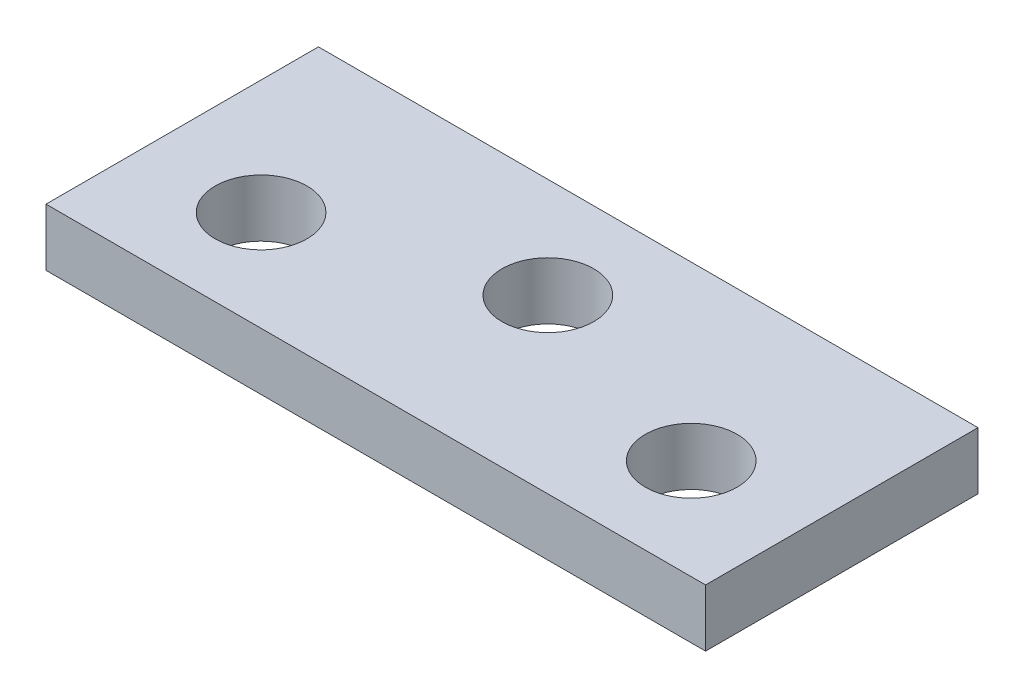
ISO-10303-21;
HEADER;
FILE_DESCRIPTION(('STEP AP214'),'2;1');
FILE_NAME('part.step','',(''),(''),'','','');
FILE_SCHEMA(('AUTOMOTIVE_DESIGN { 1 0 10303 214 1 1 1 1 }'));
ENDSEC;
DATA;
#1=APPLICATION_CONTEXT('core data for automotive mechanical design processes');
#2=APPLICATION_PROTOCOL_DEFINITION('international standard','automotive_design',2000,#1);
#3=PRODUCT_CONTEXT('',#1,'mechanical');
#4=PRODUCT('Part','Part','',(#3));
#5=PRODUCT_RELATED_PRODUCT_CATEGORY('part','',(#4));
#6=PRODUCT_DEFINITION_FORMATION('','',#4);
#7=PRODUCT_DEFINITION_CONTEXT('part definition',#1,'design');
#8=PRODUCT_DEFINITION('design','',#6,#7);
#9=PRODUCT_DEFINITION_SHAPE('','',#8);
#10=(LENGTH_UNIT() NAMED_UNIT(*) SI_UNIT(.MILLI.,.METRE.));
#11=(NAMED_UNIT(*) PLANE_ANGLE_UNIT() SI_UNIT($,.RADIAN.));
#12=(NAMED_UNIT(*) SI_UNIT($,.STERADIAN.) SOLID_ANGLE_UNIT());
#13=UNCERTAINTY_MEASURE_WITH_UNIT(LENGTH_MEASURE(1.E-05),#10,'distance_accuracy_value','');
#14=(GEOMETRIC_REPRESENTATION_CONTEXT(3) GLOBAL_UNCERTAINTY_ASSIGNED_CONTEXT((#13)) GLOBAL_UNIT_ASSIGNED_CONTEXT((#10,
#11,#12)) REPRESENTATION_CONTEXT('',''));
#15=CARTESIAN_POINT('',(0.,0.,0.));
#16=DIRECTION('',(0.,0.,1.));
#17=DIRECTION('',(1.,0.,0.));
#18=AXIS2_PLACEMENT_3D('',#15,#16,#17);
#19=CARTESIAN_POINT('',(-11.5,2.,4.75));
#20=DIRECTION('',(1.,0.,0.));
#21=DIRECTION('',(0.,0.,-1.));
#22=AXIS2_PLACEMENT_3D('',#19,#20,#21);
#23=PLANE('',#22);
#24=DIRECTION('',(0.,0.,1.));
#25=VECTOR('',#24,1.);
#26=CARTESIAN_POINT('',(-11.5,0.,4.75));
#27=LINE('',#26,#25);
#28=CARTESIAN_POINT('',(-11.5,0.,-4.75));
#29=VERTEX_POINT('',#28);
#30=CARTESIAN_POINT('',(-11.5,0.,4.75));
#31=VERTEX_POINT('',#30);
#32=EDGE_CURVE('E102',#29,#31,#27,.T.);
#33=ORIENTED_EDGE('',*,*,#32,.T.);
#34=DIRECTION('',(0.,-1.,0.));
#35=VECTOR('',#34,1.);
#36=CARTESIAN_POINT('',(-11.5,2.,4.75));
#37=LINE('',#36,#35);
#38=CARTESIAN_POINT('',(-11.5,2.,4.75));
#39=VERTEX_POINT('',#38);
#40=EDGE_CURVE('E11',#39,#31,#37,.T.);
#41=ORIENTED_EDGE('',*,*,#40,.F.);
#42=DIRECTION('',(0.,0.,1.));
#43=VECTOR('',#42,1.);
#44=CARTESIAN_POINT('',(-11.5,2.,4.75));
#45=LINE('',#44,#43);
#46=CARTESIAN_POINT('',(-11.5,2.,-4.75));
#47=VERTEX_POINT('',#46);
#48=EDGE_CURVE('E90',#47,#39,#45,.T.);
#49=ORIENTED_EDGE('',*,*,#48,.F.);
#50=DIRECTION('',(0.,-1.,0.));
#51=VECTOR('',#50,1.);
#52=CARTESIAN_POINT('',(-11.5,2.,-4.75));
#53=LINE('',#52,#51);
#54=EDGE_CURVE('E98',#47,#29,#53,.T.);
#55=ORIENTED_EDGE('',*,*,#54,.T.);
#56=EDGE_LOOP('',(#33,#41,#49,#55));
#57=FACE_BOUND('',#56,.T.);
#58=ADVANCED_FACE('F39',(#57),#23,.F.);
#59=CARTESIAN_POINT('',(11.5,2.,4.75));
#60=DIRECTION('',(0.,0.,-1.));
#61=DIRECTION('',(-1.,0.,0.));
#62=AXIS2_PLACEMENT_3D('',#59,#60,#61);
#63=PLANE('',#62);
#64=DIRECTION('',(1.,0.,0.));
#65=VECTOR('',#64,1.);
#66=CARTESIAN_POINT('',(11.5,0.,4.75));
#67=LINE('',#66,#65);
#68=CARTESIAN_POINT('',(11.5,0.,4.75));
#69=VERTEX_POINT('',#68);
#70=EDGE_CURVE('E94',#31,#69,#67,.T.);
#71=ORIENTED_EDGE('',*,*,#70,.T.);
#72=DIRECTION('',(0.,-1.,0.));
#73=VECTOR('',#72,1.);
#74=CARTESIAN_POINT('',(11.5,2.,4.75));
#75=LINE('',#74,#73);
#76=CARTESIAN_POINT('',(11.5,2.,4.75));
#77=VERTEX_POINT('',#76);
#78=EDGE_CURVE('E47',#77,#69,#75,.T.);
#79=ORIENTED_EDGE('',*,*,#78,.F.);
#80=DIRECTION('',(1.,0.,0.));
#81=VECTOR('',#80,1.);
#82=CARTESIAN_POINT('',(11.5,2.,4.75));
#83=LINE('',#82,#81);
#84=EDGE_CURVE('E85',#39,#77,#83,.T.);
#85=ORIENTED_EDGE('',*,*,#84,.F.);
#86=ORIENTED_EDGE('',*,*,#40,.T.);
#87=EDGE_LOOP('',(#71,#79,#85,#86));
#88=FACE_BOUND('',#87,.T.);
#89=ADVANCED_FACE('F93',(#88),#63,.F.);
#90=CARTESIAN_POINT('',(11.5,2.,4.75));
#91=DIRECTION('',(-1.,0.,0.));
#92=DIRECTION('',(0.,0.,1.));
#93=AXIS2_PLACEMENT_3D('',#90,#91,#92);
#94=PLANE('',#93);
#95=DIRECTION('',(0.,0.,-1.));
#96=VECTOR('',#95,1.);
#97=CARTESIAN_POINT('',(11.5,0.,4.75));
#98=LINE('',#97,#96);
#99=CARTESIAN_POINT('',(11.5,0.,-4.75));
#100=VERTEX_POINT('',#99);
#101=EDGE_CURVE('E72',#69,#100,#98,.T.);
#102=ORIENTED_EDGE('',*,*,#101,.T.);
#103=DIRECTION('',(0.,-1.,0.));
#104=VECTOR('',#103,1.);
#105=CARTESIAN_POINT('',(11.5,2.,-4.75));
#106=LINE('',#105,#104);
#107=CARTESIAN_POINT('',(11.5,2.,-4.75));
#108=VERTEX_POINT('',#107);
#109=EDGE_CURVE('E95',#108,#100,#106,.T.);
#110=ORIENTED_EDGE('',*,*,#109,.F.);
#111=DIRECTION('',(0.,0.,-1.));
#112=VECTOR('',#111,1.);
#113=CARTESIAN_POINT('',(11.5,2.,4.75));
#114=LINE('',#113,#112);
#115=EDGE_CURVE('E88',#77,#108,#114,.T.);
#116=ORIENTED_EDGE('',*,*,#115,.F.);
#117=ORIENTED_EDGE('',*,*,#78,.T.);
#118=EDGE_LOOP('',(#102,#110,#116,#117));
#119=FACE_BOUND('',#118,.T.);
#120=ADVANCED_FACE('F96',(#119),#94,.F.);
#121=CARTESIAN_POINT('',(11.5,2.,-4.75));
#122=DIRECTION('',(0.,0.,1.));
#123=DIRECTION('',(1.,0.,0.));
#124=AXIS2_PLACEMENT_3D('',#121,#122,#123);
#125=PLANE('',#124);
#126=DIRECTION('',(-1.,0.,0.));
#127=VECTOR('',#126,1.);
#128=CARTESIAN_POINT('',(11.5,0.,-4.75));
#129=LINE('',#128,#127);
#130=EDGE_CURVE('E78',#100,#29,#129,.T.);
#131=ORIENTED_EDGE('',*,*,#130,.T.);
#132=ORIENTED_EDGE('',*,*,#54,.F.);
#133=DIRECTION('',(-1.,0.,0.));
#134=VECTOR('',#133,1.);
#135=CARTESIAN_POINT('',(11.5,2.,-4.75));
#136=LINE('',#135,#134);
#137=EDGE_CURVE('E55',#108,#47,#136,.T.);
#138=ORIENTED_EDGE('',*,*,#137,.F.);
#139=ORIENTED_EDGE('',*,*,#109,.T.);
#140=EDGE_LOOP('',(#131,#132,#138,#139));
#141=FACE_BOUND('',#140,.T.);
#142=ADVANCED_FACE('F110',(#141),#125,.F.);
#143=CARTESIAN_POINT('',(0.,2.,0.));
#144=DIRECTION('',(0.,1.,0.));
#145=DIRECTION('',(0.,0.,1.));
#146=AXIS2_PLACEMENT_3D('',#143,#144,#145);
#147=PLANE('',#146);
#148=CARTESIAN_POINT('',(-7.5,2.,1.25));
#149=DIRECTION('',(0.,1.,0.));
#150=DIRECTION('',(0.,0.,1.));
#151=AXIS2_PLACEMENT_3D('',#148,#149,#150);
#152=CIRCLE('',#151,1.6);
#153=CARTESIAN_POINT('',(-7.5,2.,2.85));
#154=VERTEX_POINT('',#153);
#155=EDGE_CURVE('E128',#154,#154,#152,.T.);
#156=ORIENTED_EDGE('',*,*,#155,.F.);
#157=EDGE_LOOP('',(#156));
#158=FACE_BOUND('',#157,.T.);
#159=CARTESIAN_POINT('',(7.5,2.,1.25));
#160=DIRECTION('',(0.,1.,0.));
#161=DIRECTION('',(0.,0.,1.));
#162=AXIS2_PLACEMENT_3D('',#159,#160,#161);
#163=CIRCLE('',#162,1.6);
#164=CARTESIAN_POINT('',(7.5,2.,2.85));
#165=VERTEX_POINT('',#164);
#166=EDGE_CURVE('E122',#165,#165,#163,.T.);
#167=ORIENTED_EDGE('',*,*,#166,.F.);
#168=EDGE_LOOP('',(#167));
#169=FACE_BOUND('',#168,.T.);
#170=CARTESIAN_POINT('',(0.,2.,-1.25));
#171=DIRECTION('',(0.,1.,0.));
#172=DIRECTION('',(0.,0.,1.));
#173=AXIS2_PLACEMENT_3D('',#170,#171,#172);
#174=CIRCLE('',#173,1.6);
#175=CARTESIAN_POINT('',(0.,2.,0.349999999999997));
#176=VERTEX_POINT('',#175);
#177=EDGE_CURVE('E116',#176,#176,#174,.T.);
#178=ORIENTED_EDGE('',*,*,#177,.F.);
#179=EDGE_LOOP('',(#178));
#180=FACE_BOUND('',#179,.T.);
#181=ORIENTED_EDGE('',*,*,#48,.T.);
#182=ORIENTED_EDGE('',*,*,#84,.T.);
#183=ORIENTED_EDGE('',*,*,#115,.T.);
#184=ORIENTED_EDGE('',*,*,#137,.T.);
#185=EDGE_LOOP('',(#181,#182,#183,#184));
#186=FACE_BOUND('',#185,.T.);
#187=ADVANCED_FACE('F86',(#158,#169,#180,#186),#147,.T.);
#188=CARTESIAN_POINT('',(0.,0.,0.));
#189=DIRECTION('',(0.,1.,0.));
#190=DIRECTION('',(0.,0.,1.));
#191=AXIS2_PLACEMENT_3D('',#188,#189,#190);
#192=PLANE('',#191);
#193=CARTESIAN_POINT('',(-7.5,0.,1.25));
#194=DIRECTION('',(0.,1.,0.));
#195=DIRECTION('',(0.,0.,1.));
#196=AXIS2_PLACEMENT_3D('',#193,#194,#195);
#197=CIRCLE('',#196,1.6);
#198=CARTESIAN_POINT('',(-7.5,0.,2.85));
#199=VERTEX_POINT('',#198);
#200=EDGE_CURVE('E105',#199,#199,#197,.T.);
#201=ORIENTED_EDGE('',*,*,#200,.T.);
#202=EDGE_LOOP('',(#201));
#203=FACE_BOUND('',#202,.T.);
#204=CARTESIAN_POINT('',(7.5,0.,1.25));
#205=DIRECTION('',(0.,1.,0.));
#206=DIRECTION('',(0.,0.,1.));
#207=AXIS2_PLACEMENT_3D('',#204,#205,#206);
#208=CIRCLE('',#207,1.6);
#209=CARTESIAN_POINT('',(7.5,0.,2.85));
#210=VERTEX_POINT('',#209);
#211=EDGE_CURVE('E125',#210,#210,#208,.T.);
#212=ORIENTED_EDGE('',*,*,#211,.T.);
#213=EDGE_LOOP('',(#212));
#214=FACE_BOUND('',#213,.T.);
#215=CARTESIAN_POINT('',(0.,0.,-1.25));
#216=DIRECTION('',(0.,1.,0.));
#217=DIRECTION('',(0.,0.,1.));
#218=AXIS2_PLACEMENT_3D('',#215,#216,#217);
#219=CIRCLE('',#218,1.6);
#220=CARTESIAN_POINT('',(0.,0.,0.349999999999997));
#221=VERTEX_POINT('',#220);
#222=EDGE_CURVE('E119',#221,#221,#219,.T.);
#223=ORIENTED_EDGE('',*,*,#222,.T.);
#224=EDGE_LOOP('',(#223));
#225=FACE_BOUND('',#224,.T.);
#226=ORIENTED_EDGE('',*,*,#32,.F.);
#227=ORIENTED_EDGE('',*,*,#130,.F.);
#228=ORIENTED_EDGE('',*,*,#101,.F.);
#229=ORIENTED_EDGE('',*,*,#70,.F.);
#230=EDGE_LOOP('',(#226,#227,#228,#229));
#231=FACE_BOUND('',#230,.T.);
#232=ADVANCED_FACE('F113',(#203,#214,#225,#231),#192,.F.);
#233=CARTESIAN_POINT('',(0.,0.,-1.25));
#234=DIRECTION('',(0.,1.,0.));
#235=DIRECTION('',(0.,0.,1.));
#236=AXIS2_PLACEMENT_3D('',#233,#234,#235);
#237=CYLINDRICAL_SURFACE('',#236,1.6);
#238=ORIENTED_EDGE('',*,*,#222,.F.);
#239=EDGE_LOOP('',(#238));
#240=FACE_BOUND('',#239,.T.);
#241=ORIENTED_EDGE('',*,*,#177,.T.);
#242=EDGE_LOOP('',(#241));
#243=FACE_BOUND('',#242,.T.);
#244=ADVANCED_FACE('F150',(#240,#243),#237,.F.);
#245=CARTESIAN_POINT('',(7.5,0.,1.25));
#246=DIRECTION('',(0.,1.,0.));
#247=DIRECTION('',(0.,0.,1.));
#248=AXIS2_PLACEMENT_3D('',#245,#246,#247);
#249=CYLINDRICAL_SURFACE('',#248,1.6);
#250=ORIENTED_EDGE('',*,*,#211,.F.);
#251=EDGE_LOOP('',(#250));
#252=FACE_BOUND('',#251,.T.);
#253=ORIENTED_EDGE('',*,*,#166,.T.);
#254=EDGE_LOOP('',(#253));
#255=FACE_BOUND('',#254,.T.);
#256=ADVANCED_FACE('F139',(#252,#255),#249,.F.);
#257=CARTESIAN_POINT('',(-7.5,0.,1.25));
#258=DIRECTION('',(0.,1.,0.));
#259=DIRECTION('',(0.,0.,1.));
#260=AXIS2_PLACEMENT_3D('',#257,#258,#259);
#261=CYLINDRICAL_SURFACE('',#260,1.6);
#262=ORIENTED_EDGE('',*,*,#200,.F.);
#263=EDGE_LOOP('',(#262));
#264=FACE_BOUND('',#263,.T.);
#265=ORIENTED_EDGE('',*,*,#155,.T.);
#266=EDGE_LOOP('',(#265));
#267=FACE_BOUND('',#266,.T.);
#268=ADVANCED_FACE('F136',(#264,#267),#261,.F.);
#269=CLOSED_SHELL('',(#58,#89,#120,#142,#187,#232,#244,#256,#268));
#270=MANIFOLD_SOLID_BREP('B2',#269);
#271=ADVANCED_BREP_SHAPE_REPRESENTATION('',(#18,#270),#14);
#272=SHAPE_DEFINITION_REPRESENTATION(#9,#271);
ENDSEC;
END-ISO-10303-21;
